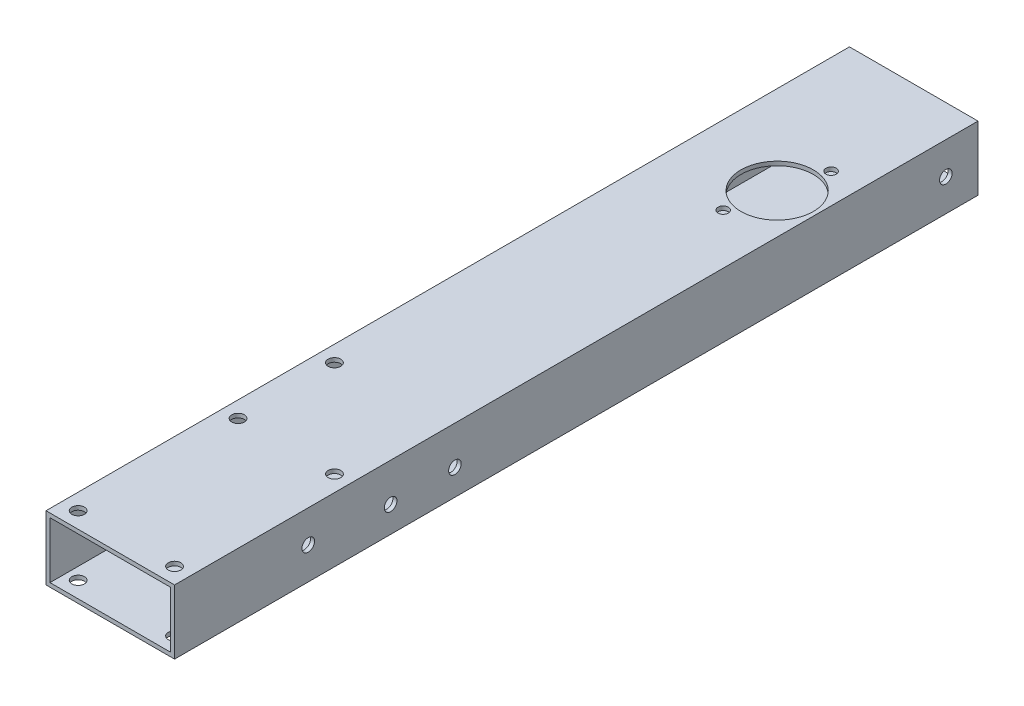
ISO-10303-21;
HEADER;
FILE_DESCRIPTION(('STEP AP214'),'2;1');
FILE_NAME('part.step','',(''),(''),'','','');
FILE_SCHEMA(('AUTOMOTIVE_DESIGN { 1 0 10303 214 1 1 1 1 }'));
ENDSEC;
DATA;
#1=APPLICATION_CONTEXT('core data for automotive mechanical design processes');
#2=APPLICATION_PROTOCOL_DEFINITION('international standard','automotive_design',2000,#1);
#3=PRODUCT_CONTEXT('',#1,'mechanical');
#4=PRODUCT('Part','Part','',(#3));
#5=PRODUCT_RELATED_PRODUCT_CATEGORY('part','',(#4));
#6=PRODUCT_DEFINITION_FORMATION('','',#4);
#7=PRODUCT_DEFINITION_CONTEXT('part definition',#1,'design');
#8=PRODUCT_DEFINITION('design','',#6,#7);
#9=PRODUCT_DEFINITION_SHAPE('','',#8);
#10=(LENGTH_UNIT() NAMED_UNIT(*) SI_UNIT(.MILLI.,.METRE.));
#11=(NAMED_UNIT(*) PLANE_ANGLE_UNIT() SI_UNIT($,.RADIAN.));
#12=(NAMED_UNIT(*) SI_UNIT($,.STERADIAN.) SOLID_ANGLE_UNIT());
#13=UNCERTAINTY_MEASURE_WITH_UNIT(LENGTH_MEASURE(1.E-05),#10,'distance_accuracy_value','');
#14=(GEOMETRIC_REPRESENTATION_CONTEXT(3) GLOBAL_UNCERTAINTY_ASSIGNED_CONTEXT((#13)) GLOBAL_UNIT_ASSIGNED_CONTEXT((#10,
#11,#12)) REPRESENTATION_CONTEXT('',''));
#15=CARTESIAN_POINT('',(0.,0.,0.));
#16=DIRECTION('',(0.,0.,1.));
#17=DIRECTION('',(1.,0.,0.));
#18=AXIS2_PLACEMENT_3D('',#15,#16,#17);
#19=CARTESIAN_POINT('',(25.4,-12.7,158.750000508));
#20=DIRECTION('',(-1.,0.,0.));
#21=DIRECTION('',(0.,0.,1.));
#22=AXIS2_PLACEMENT_3D('',#19,#20,#21);
#23=PLANE('',#22);
#24=CARTESIAN_POINT('',(25.4,7.7715611723761E-13,-146.050000508429));
#25=DIRECTION('',(1.,0.,0.));
#26=DIRECTION('',(0.,0.,-1.));
#27=AXIS2_PLACEMENT_3D('',#24,#25,#26);
#28=CIRCLE('',#27,2.48919999999999);
#29=CARTESIAN_POINT('',(25.4,7.7715611723761E-13,-148.539200508429));
#30=VERTEX_POINT('',#29);
#31=EDGE_CURVE('E469',#30,#30,#28,.T.);
#32=ORIENTED_EDGE('',*,*,#31,.F.);
#33=EDGE_LOOP('',(#32));
#34=FACE_BOUND('',#33,.T.);
#35=CARTESIAN_POINT('',(25.4,-2.42500000000023,73.35818864884));
#36=DIRECTION('',(-1.,0.,0.));
#37=DIRECTION('',(0.,0.,1.));
#38=AXIS2_PLACEMENT_3D('',#35,#36,#37);
#39=CIRCLE('',#38,2.48919999999998);
#40=CARTESIAN_POINT('',(25.4,-2.42500000000023,75.84738864884));
#41=VERTEX_POINT('',#40);
#42=EDGE_CURVE('E244',#41,#41,#39,.T.);
#43=ORIENTED_EDGE('',*,*,#42,.T.);
#44=EDGE_LOOP('',(#43));
#45=FACE_BOUND('',#44,.T.);
#46=CARTESIAN_POINT('',(25.4,-2.42500000000023,47.95818864884));
#47=DIRECTION('',(-1.,0.,0.));
#48=DIRECTION('',(0.,0.,1.));
#49=AXIS2_PLACEMENT_3D('',#46,#47,#48);
#50=CIRCLE('',#49,2.48919999999998);
#51=CARTESIAN_POINT('',(25.4,-2.42500000000023,50.44738864884));
#52=VERTEX_POINT('',#51);
#53=EDGE_CURVE('E238',#52,#52,#50,.T.);
#54=ORIENTED_EDGE('',*,*,#53,.T.);
#55=EDGE_LOOP('',(#54));
#56=FACE_BOUND('',#55,.T.);
#57=DIRECTION('',(0.,0.,-1.));
#58=VECTOR('',#57,1.);
#59=CARTESIAN_POINT('',(25.4,-12.7,158.750000508));
#60=LINE('',#59,#58);
#61=CARTESIAN_POINT('',(25.4,-12.7,158.750000508));
#62=VERTEX_POINT('',#61);
#63=CARTESIAN_POINT('',(25.4,-12.7,-158.750000508));
#64=VERTEX_POINT('',#63);
#65=EDGE_CURVE('E66',#62,#64,#60,.T.);
#66=ORIENTED_EDGE('',*,*,#65,.T.);
#67=DIRECTION('',(0.,1.,0.));
#68=VECTOR('',#67,1.);
#69=CARTESIAN_POINT('',(25.4,-12.7,-158.750000508));
#70=LINE('',#69,#68);
#71=CARTESIAN_POINT('',(25.4,12.7,-158.750000508));
#72=VERTEX_POINT('',#71);
#73=EDGE_CURVE('E180',#64,#72,#70,.T.);
#74=ORIENTED_EDGE('',*,*,#73,.T.);
#75=DIRECTION('',(0.,0.,-1.));
#76=VECTOR('',#75,1.);
#77=CARTESIAN_POINT('',(25.4,12.7,158.750000508));
#78=LINE('',#77,#76);
#79=CARTESIAN_POINT('',(25.4,12.7,158.750000508));
#80=VERTEX_POINT('',#79);
#81=EDGE_CURVE('E225',#80,#72,#78,.T.);
#82=ORIENTED_EDGE('',*,*,#81,.F.);
#83=DIRECTION('',(0.,1.,0.));
#84=VECTOR('',#83,1.);
#85=CARTESIAN_POINT('',(25.4,-12.7,158.750000508));
#86=LINE('',#85,#84);
#87=EDGE_CURVE('E216',#62,#80,#86,.T.);
#88=ORIENTED_EDGE('',*,*,#87,.F.);
#89=EDGE_LOOP('',(#66,#74,#82,#88));
#90=FACE_BOUND('',#89,.T.);
#91=CARTESIAN_POINT('',(25.4,7.49400541621981E-13,105.917999491571));
#92=DIRECTION('',(1.,0.,0.));
#93=DIRECTION('',(0.,0.,-1.));
#94=AXIS2_PLACEMENT_3D('',#91,#92,#93);
#95=CIRCLE('',#94,2.48919999999999);
#96=CARTESIAN_POINT('',(25.4,7.49400541621981E-13,103.428799491571));
#97=VERTEX_POINT('',#96);
#98=EDGE_CURVE('E479',#97,#97,#95,.T.);
#99=ORIENTED_EDGE('',*,*,#98,.F.);
#100=EDGE_LOOP('',(#99));
#101=FACE_BOUND('',#100,.T.);
#102=ADVANCED_FACE('F56',(#34,#45,#56,#90,#101),#23,.F.);
#103=CARTESIAN_POINT('',(0.,0.,158.750000508));
#104=DIRECTION('',(0.,0.,1.));
#105=DIRECTION('',(1.,0.,0.));
#106=AXIS2_PLACEMENT_3D('',#103,#104,#105);
#107=PLANE('',#106);
#108=DIRECTION('',(0.,-1.,0.));
#109=VECTOR('',#108,1.);
#110=CARTESIAN_POINT('',(-25.4,12.7,158.750000508));
#111=LINE('',#110,#109);
#112=CARTESIAN_POINT('',(-25.4,12.7,158.750000508));
#113=VERTEX_POINT('',#112);
#114=CARTESIAN_POINT('',(-25.4,-12.7,158.750000508));
#115=VERTEX_POINT('',#114);
#116=EDGE_CURVE('E139',#113,#115,#111,.T.);
#117=ORIENTED_EDGE('',*,*,#116,.T.);
#118=DIRECTION('',(1.,0.,0.));
#119=VECTOR('',#118,1.);
#120=CARTESIAN_POINT('',(-25.4,-12.7,158.750000508));
#121=LINE('',#120,#119);
#122=EDGE_CURVE('E213',#115,#62,#121,.T.);
#123=ORIENTED_EDGE('',*,*,#122,.T.);
#124=ORIENTED_EDGE('',*,*,#87,.T.);
#125=DIRECTION('',(-1.,0.,0.));
#126=VECTOR('',#125,1.);
#127=CARTESIAN_POINT('',(25.4,12.7,158.750000508));
#128=LINE('',#127,#126);
#129=EDGE_CURVE('E219',#80,#113,#128,.T.);
#130=ORIENTED_EDGE('',*,*,#129,.T.);
#131=EDGE_LOOP('',(#117,#123,#124,#130));
#132=FACE_BOUND('',#131,.T.);
#133=DIRECTION('',(1.,0.,0.));
#134=VECTOR('',#133,1.);
#135=CARTESIAN_POINT('',(-23.8125,-11.1125,158.750000508));
#136=LINE('',#135,#134);
#137=CARTESIAN_POINT('',(-23.8125,-11.1125,158.750000508));
#138=VERTEX_POINT('',#137);
#139=CARTESIAN_POINT('',(23.8125,-11.1125,158.750000508));
#140=VERTEX_POINT('',#139);
#141=EDGE_CURVE('E190',#138,#140,#136,.T.);
#142=ORIENTED_EDGE('',*,*,#141,.F.);
#143=DIRECTION('',(0.,-1.,0.));
#144=VECTOR('',#143,1.);
#145=CARTESIAN_POINT('',(-23.8125,11.1125,158.750000508));
#146=LINE('',#145,#144);
#147=CARTESIAN_POINT('',(-23.8125,11.1125,158.750000508));
#148=VERTEX_POINT('',#147);
#149=EDGE_CURVE('E135',#148,#138,#146,.T.);
#150=ORIENTED_EDGE('',*,*,#149,.F.);
#151=DIRECTION('',(-1.,0.,0.));
#152=VECTOR('',#151,1.);
#153=CARTESIAN_POINT('',(23.8125,11.1125,158.750000508));
#154=LINE('',#153,#152);
#155=CARTESIAN_POINT('',(23.8125,11.1125,158.750000508));
#156=VERTEX_POINT('',#155);
#157=EDGE_CURVE('E197',#156,#148,#154,.T.);
#158=ORIENTED_EDGE('',*,*,#157,.F.);
#159=DIRECTION('',(0.,1.,0.));
#160=VECTOR('',#159,1.);
#161=CARTESIAN_POINT('',(23.8125,-11.1125,158.750000508));
#162=LINE('',#161,#160);
#163=EDGE_CURVE('E193',#140,#156,#162,.T.);
#164=ORIENTED_EDGE('',*,*,#163,.F.);
#165=EDGE_LOOP('',(#142,#150,#158,#164));
#166=FACE_BOUND('',#165,.T.);
#167=ADVANCED_FACE('F490',(#132,#166),#107,.T.);
#168=CARTESIAN_POINT('',(-25.4,12.7,158.750000508));
#169=DIRECTION('',(1.,0.,0.));
#170=DIRECTION('',(0.,0.,-1.));
#171=AXIS2_PLACEMENT_3D('',#168,#169,#170);
#172=PLANE('',#171);
#173=CARTESIAN_POINT('',(-25.4,-2.42500000000023,73.35818864884));
#174=DIRECTION('',(-1.,0.,0.));
#175=DIRECTION('',(0.,0.,1.));
#176=AXIS2_PLACEMENT_3D('',#173,#174,#175);
#177=CIRCLE('',#176,2.48919999999999);
#178=CARTESIAN_POINT('',(-25.4,-2.42500000000023,75.84738864884));
#179=VERTEX_POINT('',#178);
#180=EDGE_CURVE('E366',#179,#179,#177,.T.);
#181=ORIENTED_EDGE('',*,*,#180,.F.);
#182=EDGE_LOOP('',(#181));
#183=FACE_BOUND('',#182,.T.);
#184=CARTESIAN_POINT('',(-25.4,-2.42500000000023,47.95818864884));
#185=DIRECTION('',(-1.,0.,0.));
#186=DIRECTION('',(0.,0.,1.));
#187=AXIS2_PLACEMENT_3D('',#184,#185,#186);
#188=CIRCLE('',#187,2.48919999999999);
#189=CARTESIAN_POINT('',(-25.4,-2.42500000000023,50.44738864884));
#190=VERTEX_POINT('',#189);
#191=EDGE_CURVE('E376',#190,#190,#188,.T.);
#192=ORIENTED_EDGE('',*,*,#191,.F.);
#193=EDGE_LOOP('',(#192));
#194=FACE_BOUND('',#193,.T.);
#195=DIRECTION('',(0.,0.,-1.));
#196=VECTOR('',#195,1.);
#197=CARTESIAN_POINT('',(-25.4,12.7,158.750000508));
#198=LINE('',#197,#196);
#199=CARTESIAN_POINT('',(-25.4,12.7,-158.750000508));
#200=VERTEX_POINT('',#199);
#201=EDGE_CURVE('E222',#113,#200,#198,.T.);
#202=ORIENTED_EDGE('',*,*,#201,.T.);
#203=DIRECTION('',(0.,-1.,0.));
#204=VECTOR('',#203,1.);
#205=CARTESIAN_POINT('',(-25.4,12.7,-158.750000508));
#206=LINE('',#205,#204);
#207=CARTESIAN_POINT('',(-25.4,-12.7,-158.750000508));
#208=VERTEX_POINT('',#207);
#209=EDGE_CURVE('E172',#200,#208,#206,.T.);
#210=ORIENTED_EDGE('',*,*,#209,.T.);
#211=DIRECTION('',(0.,0.,-1.));
#212=VECTOR('',#211,1.);
#213=CARTESIAN_POINT('',(-25.4,-12.7,158.750000508));
#214=LINE('',#213,#212);
#215=EDGE_CURVE('E13',#115,#208,#214,.T.);
#216=ORIENTED_EDGE('',*,*,#215,.F.);
#217=ORIENTED_EDGE('',*,*,#116,.F.);
#218=EDGE_LOOP('',(#202,#210,#216,#217));
#219=FACE_BOUND('',#218,.T.);
#220=ADVANCED_FACE('F58',(#183,#194,#219),#172,.F.);
#221=CARTESIAN_POINT('',(-25.4,-12.7,158.750000508));
#222=DIRECTION('',(0.,1.,0.));
#223=DIRECTION('',(-1.,0.,0.));
#224=AXIS2_PLACEMENT_3D('',#221,#222,#223);
#225=PLANE('',#224);
#226=CARTESIAN_POINT('',(13.5246297417502,-12.7,-112.574300260917));
#227=DIRECTION('',(0.,1.,0.));
#228=DIRECTION('',(0.,0.,1.));
#229=AXIS2_PLACEMENT_3D('',#226,#227,#228);
#230=CIRCLE('',#229,2.0447);
#231=CARTESIAN_POINT('',(13.5246297417502,-12.7,-110.529600260917));
#232=VERTEX_POINT('',#231);
#233=EDGE_CURVE('E278',#232,#232,#230,.T.);
#234=ORIENTED_EDGE('',*,*,#233,.T.);
#235=EDGE_LOOP('',(#234));
#236=FACE_BOUND('',#235,.T.);
#237=CARTESIAN_POINT('',(5.52537025825205,-12.7,-77.9257007550834));
#238=DIRECTION('',(0.,1.,0.));
#239=DIRECTION('',(0.,0.,1.));
#240=AXIS2_PLACEMENT_3D('',#237,#238,#239);
#241=CIRCLE('',#240,2.0447);
#242=CARTESIAN_POINT('',(5.52537025825205,-12.7,-75.8810007550834));
#243=VERTEX_POINT('',#242);
#244=EDGE_CURVE('E273',#243,#243,#241,.T.);
#245=ORIENTED_EDGE('',*,*,#244,.T.);
#246=EDGE_LOOP('',(#245));
#247=FACE_BOUND('',#246,.T.);
#248=CARTESIAN_POINT('',(-19.0500000000028,-12.7,51.11308049299));
#249=DIRECTION('',(0.,-1.,0.));
#250=DIRECTION('',(0.,0.,-1.));
#251=AXIS2_PLACEMENT_3D('',#248,#249,#250);
#252=CIRCLE('',#251,2.48919999999999);
#253=CARTESIAN_POINT('',(-19.0500000000028,-12.7,48.62388049299));
#254=VERTEX_POINT('',#253);
#255=EDGE_CURVE('E310',#254,#254,#252,.T.);
#256=ORIENTED_EDGE('',*,*,#255,.F.);
#257=EDGE_LOOP('',(#256));
#258=FACE_BOUND('',#257,.T.);
#259=CARTESIAN_POINT('',(-19.050000000002,-12.7,89.2130804929901));
#260=DIRECTION('',(0.,-1.,0.));
#261=DIRECTION('',(0.,0.,-1.));
#262=AXIS2_PLACEMENT_3D('',#259,#260,#261);
#263=CIRCLE('',#262,2.48919999999999);
#264=CARTESIAN_POINT('',(-19.050000000002,-12.7,86.7238804929901));
#265=VERTEX_POINT('',#264);
#266=EDGE_CURVE('E320',#265,#265,#263,.T.);
#267=ORIENTED_EDGE('',*,*,#266,.F.);
#268=EDGE_LOOP('',(#267));
#269=FACE_BOUND('',#268,.T.);
#270=CARTESIAN_POINT('',(19.0499999999981,-12.7,89.2130804929891));
#271=DIRECTION('',(0.,-1.,0.));
#272=DIRECTION('',(0.,0.,-1.));
#273=AXIS2_PLACEMENT_3D('',#270,#271,#272);
#274=CIRCLE('',#273,2.48919999999999);
#275=CARTESIAN_POINT('',(19.0499999999981,-12.7,86.7238804929891));
#276=VERTEX_POINT('',#275);
#277=EDGE_CURVE('E330',#276,#276,#274,.T.);
#278=ORIENTED_EDGE('',*,*,#277,.F.);
#279=EDGE_LOOP('',(#278));
#280=FACE_BOUND('',#279,.T.);
#281=CARTESIAN_POINT('',(19.0499999999997,-12.7,152.400000507999));
#282=DIRECTION('',(0.,-1.,0.));
#283=DIRECTION('',(0.,0.,-1.));
#284=AXIS2_PLACEMENT_3D('',#281,#282,#283);
#285=CIRCLE('',#284,2.48919999999999);
#286=CARTESIAN_POINT('',(19.0499999999997,-12.7,149.910800507999));
#287=VERTEX_POINT('',#286);
#288=EDGE_CURVE('E340',#287,#287,#285,.T.);
#289=ORIENTED_EDGE('',*,*,#288,.F.);
#290=EDGE_LOOP('',(#289));
#291=FACE_BOUND('',#290,.T.);
#292=CARTESIAN_POINT('',(-19.0500000000003,-12.7,152.400000508));
#293=DIRECTION('',(0.,-1.,0.));
#294=DIRECTION('',(0.,0.,-1.));
#295=AXIS2_PLACEMENT_3D('',#292,#293,#294);
#296=CIRCLE('',#295,2.48919999999999);
#297=CARTESIAN_POINT('',(-19.0500000000003,-12.7,149.910800508));
#298=VERTEX_POINT('',#297);
#299=EDGE_CURVE('E356',#298,#298,#296,.T.);
#300=ORIENTED_EDGE('',*,*,#299,.F.);
#301=EDGE_LOOP('',(#300));
#302=FACE_BOUND('',#301,.T.);
#303=CARTESIAN_POINT('',(9.52500000000001,-12.7,-95.250000508));
#304=DIRECTION('',(0.,1.,0.));
#305=DIRECTION('',(-1.,0.,0.));
#306=AXIS2_PLACEMENT_3D('',#303,#304,#305);
#307=CIRCLE('',#306,14.2875);
#308=CARTESIAN_POINT('',(-4.7625,-12.7,-95.250000508));
#309=VERTEX_POINT('',#308);
#310=EDGE_CURVE('E159',#309,#309,#307,.T.);
#311=ORIENTED_EDGE('',*,*,#310,.T.);
#312=EDGE_LOOP('',(#311));
#313=FACE_BOUND('',#312,.T.);
#314=ORIENTED_EDGE('',*,*,#215,.T.);
#315=DIRECTION('',(1.,0.,0.));
#316=VECTOR('',#315,1.);
#317=CARTESIAN_POINT('',(-25.4,-12.7,-158.750000508));
#318=LINE('',#317,#316);
#319=EDGE_CURVE('E176',#208,#64,#318,.T.);
#320=ORIENTED_EDGE('',*,*,#319,.T.);
#321=ORIENTED_EDGE('',*,*,#65,.F.);
#322=ORIENTED_EDGE('',*,*,#122,.F.);
#323=EDGE_LOOP('',(#314,#320,#321,#322));
#324=FACE_BOUND('',#323,.T.);
#325=ADVANCED_FACE('F504',(#236,#247,#258,#269,#280,#291,#302,#313,#324),#225,.F.);
#326=CARTESIAN_POINT('',(25.4,12.7,158.750000508));
#327=DIRECTION('',(0.,-1.,0.));
#328=DIRECTION('',(1.,0.,0.));
#329=AXIS2_PLACEMENT_3D('',#326,#327,#328);
#330=PLANE('',#329);
#331=CARTESIAN_POINT('',(13.5246297417502,12.7,-112.574300260917));
#332=DIRECTION('',(0.,1.,0.));
#333=DIRECTION('',(0.,0.,1.));
#334=AXIS2_PLACEMENT_3D('',#331,#332,#333);
#335=CIRCLE('',#334,2.0447);
#336=CARTESIAN_POINT('',(13.5246297417502,12.7,-110.529600260917));
#337=VERTEX_POINT('',#336);
#338=EDGE_CURVE('E289',#337,#337,#335,.T.);
#339=ORIENTED_EDGE('',*,*,#338,.F.);
#340=EDGE_LOOP('',(#339));
#341=FACE_BOUND('',#340,.T.);
#342=CARTESIAN_POINT('',(5.52537025825205,12.7,-77.9257007550834));
#343=DIRECTION('',(0.,1.,0.));
#344=DIRECTION('',(0.,0.,1.));
#345=AXIS2_PLACEMENT_3D('',#342,#343,#344);
#346=CIRCLE('',#345,2.0447);
#347=CARTESIAN_POINT('',(5.52537025825205,12.7,-75.8810007550834));
#348=VERTEX_POINT('',#347);
#349=EDGE_CURVE('E286',#348,#348,#346,.T.);
#350=ORIENTED_EDGE('',*,*,#349,.F.);
#351=EDGE_LOOP('',(#350));
#352=FACE_BOUND('',#351,.T.);
#353=CARTESIAN_POINT('',(-19.0500000000028,12.7,51.11308049299));
#354=DIRECTION('',(0.,-1.,0.));
#355=DIRECTION('',(0.,0.,-1.));
#356=AXIS2_PLACEMENT_3D('',#353,#354,#355);
#357=CIRCLE('',#356,2.48919999999999);
#358=CARTESIAN_POINT('',(-19.0500000000028,12.7,48.62388049299));
#359=VERTEX_POINT('',#358);
#360=EDGE_CURVE('E268',#359,#359,#357,.T.);
#361=ORIENTED_EDGE('',*,*,#360,.T.);
#362=EDGE_LOOP('',(#361));
#363=FACE_BOUND('',#362,.T.);
#364=CARTESIAN_POINT('',(-19.050000000002,12.7,89.2130804929901));
#365=DIRECTION('',(0.,-1.,0.));
#366=DIRECTION('',(0.,0.,-1.));
#367=AXIS2_PLACEMENT_3D('',#364,#365,#366);
#368=CIRCLE('',#367,2.48919999999999);
#369=CARTESIAN_POINT('',(-19.050000000002,12.7,86.7238804929901));
#370=VERTEX_POINT('',#369);
#371=EDGE_CURVE('E262',#370,#370,#368,.T.);
#372=ORIENTED_EDGE('',*,*,#371,.T.);
#373=EDGE_LOOP('',(#372));
#374=FACE_BOUND('',#373,.T.);
#375=CARTESIAN_POINT('',(19.0499999999981,12.7,89.2130804929891));
#376=DIRECTION('',(0.,-1.,0.));
#377=DIRECTION('',(0.,0.,-1.));
#378=AXIS2_PLACEMENT_3D('',#375,#376,#377);
#379=CIRCLE('',#378,2.48919999999999);
#380=CARTESIAN_POINT('',(19.0499999999981,12.7,86.7238804929891));
#381=VERTEX_POINT('',#380);
#382=EDGE_CURVE('E256',#381,#381,#379,.T.);
#383=ORIENTED_EDGE('',*,*,#382,.T.);
#384=EDGE_LOOP('',(#383));
#385=FACE_BOUND('',#384,.T.);
#386=CARTESIAN_POINT('',(19.0499999999997,12.7,152.400000507999));
#387=DIRECTION('',(0.,-1.,0.));
#388=DIRECTION('',(0.,0.,-1.));
#389=AXIS2_PLACEMENT_3D('',#386,#387,#388);
#390=CIRCLE('',#389,2.48919999999999);
#391=CARTESIAN_POINT('',(19.0499999999997,12.7,149.910800507999));
#392=VERTEX_POINT('',#391);
#393=EDGE_CURVE('E344',#392,#392,#390,.T.);
#394=ORIENTED_EDGE('',*,*,#393,.T.);
#395=EDGE_LOOP('',(#394));
#396=FACE_BOUND('',#395,.T.);
#397=CARTESIAN_POINT('',(-19.0500000000003,12.7,152.400000508));
#398=DIRECTION('',(0.,-1.,0.));
#399=DIRECTION('',(0.,0.,-1.));
#400=AXIS2_PLACEMENT_3D('',#397,#398,#399);
#401=CIRCLE('',#400,2.48919999999999);
#402=CARTESIAN_POINT('',(-19.0500000000003,12.7,149.910800508));
#403=VERTEX_POINT('',#402);
#404=EDGE_CURVE('E250',#403,#403,#401,.T.);
#405=ORIENTED_EDGE('',*,*,#404,.T.);
#406=EDGE_LOOP('',(#405));
#407=FACE_BOUND('',#406,.T.);
#408=CARTESIAN_POINT('',(9.52500000000001,12.7,-95.250000508));
#409=DIRECTION('',(0.,1.,0.));
#410=DIRECTION('',(-1.,0.,0.));
#411=AXIS2_PLACEMENT_3D('',#408,#409,#410);
#412=CIRCLE('',#411,14.2875);
#413=CARTESIAN_POINT('',(-4.7625,12.7,-95.250000508));
#414=VERTEX_POINT('',#413);
#415=EDGE_CURVE('E232',#414,#414,#412,.T.);
#416=ORIENTED_EDGE('',*,*,#415,.F.);
#417=EDGE_LOOP('',(#416));
#418=FACE_BOUND('',#417,.T.);
#419=ORIENTED_EDGE('',*,*,#81,.T.);
#420=DIRECTION('',(-1.,0.,0.));
#421=VECTOR('',#420,1.);
#422=CARTESIAN_POINT('',(25.4,12.7,-158.750000508));
#423=LINE('',#422,#421);
#424=EDGE_CURVE('E184',#72,#200,#423,.T.);
#425=ORIENTED_EDGE('',*,*,#424,.T.);
#426=ORIENTED_EDGE('',*,*,#201,.F.);
#427=ORIENTED_EDGE('',*,*,#129,.F.);
#428=EDGE_LOOP('',(#419,#425,#426,#427));
#429=FACE_BOUND('',#428,.T.);
#430=ADVANCED_FACE('F503',(#341,#352,#363,#374,#385,#396,#407,#418,#429),#330,.F.);
#431=CARTESIAN_POINT('',(-23.8125,11.1125,158.750000508));
#432=DIRECTION('',(1.,0.,0.));
#433=DIRECTION('',(0.,1.,0.));
#434=AXIS2_PLACEMENT_3D('',#431,#432,#433);
#435=PLANE('',#434);
#436=CARTESIAN_POINT('',(-23.8125,-2.42500000000023,73.35818864884));
#437=DIRECTION('',(1.,0.,0.));
#438=DIRECTION('',(0.,1.,0.));
#439=AXIS2_PLACEMENT_3D('',#436,#437,#438);
#440=CIRCLE('',#439,2.48919999999999);
#441=CARTESIAN_POINT('',(-23.8125,0.0641999999997584,73.35818864884));
#442=VERTEX_POINT('',#441);
#443=EDGE_CURVE('E243',#442,#442,#440,.T.);
#444=ORIENTED_EDGE('',*,*,#443,.F.);
#445=EDGE_LOOP('',(#444));
#446=FACE_BOUND('',#445,.T.);
#447=CARTESIAN_POINT('',(-23.8125,-2.42500000000023,47.95818864884));
#448=DIRECTION('',(1.,0.,0.));
#449=DIRECTION('',(0.,1.,0.));
#450=AXIS2_PLACEMENT_3D('',#447,#448,#449);
#451=CIRCLE('',#450,2.48919999999999);
#452=CARTESIAN_POINT('',(-23.8125,0.0641999999997584,47.95818864884));
#453=VERTEX_POINT('',#452);
#454=EDGE_CURVE('E233',#453,#453,#451,.T.);
#455=ORIENTED_EDGE('',*,*,#454,.F.);
#456=EDGE_LOOP('',(#455));
#457=FACE_BOUND('',#456,.T.);
#458=DIRECTION('',(0.,0.,-1.));
#459=VECTOR('',#458,1.);
#460=CARTESIAN_POINT('',(-23.8125,-11.1125,158.750000508));
#461=LINE('',#460,#459);
#462=CARTESIAN_POINT('',(-23.8125,-11.1125,-158.750000508));
#463=VERTEX_POINT('',#462);
#464=EDGE_CURVE('E127',#138,#463,#461,.T.);
#465=ORIENTED_EDGE('',*,*,#464,.T.);
#466=DIRECTION('',(0.,-1.,0.));
#467=VECTOR('',#466,1.);
#468=CARTESIAN_POINT('',(-23.8125,11.1125,-158.750000508));
#469=LINE('',#468,#467);
#470=CARTESIAN_POINT('',(-23.8125,11.1125,-158.750000508));
#471=VERTEX_POINT('',#470);
#472=EDGE_CURVE('E132',#471,#463,#469,.T.);
#473=ORIENTED_EDGE('',*,*,#472,.F.);
#474=DIRECTION('',(0.,0.,-1.));
#475=VECTOR('',#474,1.);
#476=CARTESIAN_POINT('',(-23.8125,11.1125,158.750000508));
#477=LINE('',#476,#475);
#478=EDGE_CURVE('E200',#148,#471,#477,.T.);
#479=ORIENTED_EDGE('',*,*,#478,.F.);
#480=ORIENTED_EDGE('',*,*,#149,.T.);
#481=EDGE_LOOP('',(#465,#473,#479,#480));
#482=FACE_BOUND('',#481,.T.);
#483=ADVANCED_FACE('F129',(#446,#457,#482),#435,.T.);
#484=CARTESIAN_POINT('',(-23.8125,-11.1125,158.750000508));
#485=DIRECTION('',(0.,1.,0.));
#486=DIRECTION('',(0.,0.,1.));
#487=AXIS2_PLACEMENT_3D('',#484,#485,#486);
#488=PLANE('',#487);
#489=CARTESIAN_POINT('',(13.5246297417502,-11.1125,-112.574300260917));
#490=DIRECTION('',(0.,1.,0.));
#491=DIRECTION('',(0.,0.,1.));
#492=AXIS2_PLACEMENT_3D('',#489,#490,#491);
#493=CIRCLE('',#492,2.0447);
#494=CARTESIAN_POINT('',(13.5246297417502,-11.1125,-110.529600260917));
#495=VERTEX_POINT('',#494);
#496=EDGE_CURVE('E274',#495,#495,#493,.T.);
#497=ORIENTED_EDGE('',*,*,#496,.F.);
#498=EDGE_LOOP('',(#497));
#499=FACE_BOUND('',#498,.T.);
#500=CARTESIAN_POINT('',(5.52537025825205,-11.1125,-77.9257007550834));
#501=DIRECTION('',(0.,1.,0.));
#502=DIRECTION('',(0.,0.,1.));
#503=AXIS2_PLACEMENT_3D('',#500,#501,#502);
#504=CIRCLE('',#503,2.0447);
#505=CARTESIAN_POINT('',(5.52537025825205,-11.1125,-75.8810007550834));
#506=VERTEX_POINT('',#505);
#507=EDGE_CURVE('E269',#506,#506,#504,.T.);
#508=ORIENTED_EDGE('',*,*,#507,.F.);
#509=EDGE_LOOP('',(#508));
#510=FACE_BOUND('',#509,.T.);
#511=CARTESIAN_POINT('',(-19.0500000000028,-11.1125,51.11308049299));
#512=DIRECTION('',(0.,1.,0.));
#513=DIRECTION('',(0.,0.,1.));
#514=AXIS2_PLACEMENT_3D('',#511,#512,#513);
#515=CIRCLE('',#514,2.48919999999999);
#516=CARTESIAN_POINT('',(-19.0500000000028,-11.1125,53.60228049299));
#517=VERTEX_POINT('',#516);
#518=EDGE_CURVE('E263',#517,#517,#515,.T.);
#519=ORIENTED_EDGE('',*,*,#518,.F.);
#520=EDGE_LOOP('',(#519));
#521=FACE_BOUND('',#520,.T.);
#522=CARTESIAN_POINT('',(-19.050000000002,-11.1125,89.2130804929901));
#523=DIRECTION('',(0.,1.,0.));
#524=DIRECTION('',(0.,0.,1.));
#525=AXIS2_PLACEMENT_3D('',#522,#523,#524);
#526=CIRCLE('',#525,2.48919999999999);
#527=CARTESIAN_POINT('',(-19.050000000002,-11.1125,91.7022804929901));
#528=VERTEX_POINT('',#527);
#529=EDGE_CURVE('E261',#528,#528,#526,.T.);
#530=ORIENTED_EDGE('',*,*,#529,.F.);
#531=EDGE_LOOP('',(#530));
#532=FACE_BOUND('',#531,.T.);
#533=CARTESIAN_POINT('',(19.0499999999981,-11.1125,89.2130804929891));
#534=DIRECTION('',(0.,1.,0.));
#535=DIRECTION('',(0.,0.,1.));
#536=AXIS2_PLACEMENT_3D('',#533,#534,#535);
#537=CIRCLE('',#536,2.48919999999999);
#538=CARTESIAN_POINT('',(19.0499999999981,-11.1125,91.7022804929891));
#539=VERTEX_POINT('',#538);
#540=EDGE_CURVE('E255',#539,#539,#537,.T.);
#541=ORIENTED_EDGE('',*,*,#540,.F.);
#542=EDGE_LOOP('',(#541));
#543=FACE_BOUND('',#542,.T.);
#544=CARTESIAN_POINT('',(19.0499999999997,-11.1125,152.400000507999));
#545=DIRECTION('',(0.,1.,0.));
#546=DIRECTION('',(0.,0.,1.));
#547=AXIS2_PLACEMENT_3D('',#544,#545,#546);
#548=CIRCLE('',#547,2.48919999999999);
#549=CARTESIAN_POINT('',(19.0499999999997,-11.1125,154.889200507999));
#550=VERTEX_POINT('',#549);
#551=EDGE_CURVE('E348',#550,#550,#548,.T.);
#552=ORIENTED_EDGE('',*,*,#551,.F.);
#553=EDGE_LOOP('',(#552));
#554=FACE_BOUND('',#553,.T.);
#555=CARTESIAN_POINT('',(-19.0500000000003,-11.1125,152.400000508));
#556=DIRECTION('',(0.,1.,0.));
#557=DIRECTION('',(0.,0.,1.));
#558=AXIS2_PLACEMENT_3D('',#555,#556,#557);
#559=CIRCLE('',#558,2.48919999999999);
#560=CARTESIAN_POINT('',(-19.0500000000003,-11.1125,154.889200508));
#561=VERTEX_POINT('',#560);
#562=EDGE_CURVE('E249',#561,#561,#559,.T.);
#563=ORIENTED_EDGE('',*,*,#562,.F.);
#564=EDGE_LOOP('',(#563));
#565=FACE_BOUND('',#564,.T.);
#566=DIRECTION('',(0.,0.,-1.));
#567=VECTOR('',#566,1.);
#568=CARTESIAN_POINT('',(23.8125,-11.1125,158.750000508));
#569=LINE('',#568,#567);
#570=CARTESIAN_POINT('',(23.8125,-11.1125,-95.250000508));
#571=VERTEX_POINT('',#570);
#572=EDGE_CURVE('E140',#140,#571,#569,.T.);
#573=ORIENTED_EDGE('',*,*,#572,.T.);
#574=CARTESIAN_POINT('',(9.52500000000001,-11.1125,-95.250000508));
#575=DIRECTION('',(0.,1.,0.));
#576=DIRECTION('',(0.,0.,1.));
#577=AXIS2_PLACEMENT_3D('',#574,#575,#576);
#578=CIRCLE('',#577,14.2875);
#579=EDGE_CURVE('E72',#571,#571,#578,.T.);
#580=ORIENTED_EDGE('',*,*,#579,.F.);
#581=CARTESIAN_POINT('',(23.8125,-11.1125,-158.750000508));
#582=VERTEX_POINT('',#581);
#583=EDGE_CURVE('E147',#571,#582,#569,.T.);
#584=ORIENTED_EDGE('',*,*,#583,.T.);
#585=DIRECTION('',(1.,0.,0.));
#586=VECTOR('',#585,1.);
#587=CARTESIAN_POINT('',(-23.8125,-11.1125,-158.750000508));
#588=LINE('',#587,#586);
#589=EDGE_CURVE('E143',#463,#582,#588,.T.);
#590=ORIENTED_EDGE('',*,*,#589,.F.);
#591=ORIENTED_EDGE('',*,*,#464,.F.);
#592=ORIENTED_EDGE('',*,*,#141,.T.);
#593=EDGE_LOOP('',(#573,#580,#584,#590,#591,#592));
#594=FACE_BOUND('',#593,.T.);
#595=ADVANCED_FACE('F145',(#499,#510,#521,#532,#543,#554,#565,#594),#488,.T.);
#596=CARTESIAN_POINT('',(23.8125,-11.1125,158.750000508));
#597=DIRECTION('',(-1.,0.,0.));
#598=DIRECTION('',(0.,0.,1.));
#599=AXIS2_PLACEMENT_3D('',#596,#597,#598);
#600=PLANE('',#599);
#601=CARTESIAN_POINT('',(23.8125,7.49400541621981E-13,105.917999491571));
#602=DIRECTION('',(-1.,0.,0.));
#603=DIRECTION('',(0.,0.,1.));
#604=AXIS2_PLACEMENT_3D('',#601,#602,#603);
#605=CIRCLE('',#604,2.48919999999999);
#606=CARTESIAN_POINT('',(23.8125,7.49400541621981E-13,108.407199491571));
#607=VERTEX_POINT('',#606);
#608=EDGE_CURVE('E60',#607,#607,#605,.T.);
#609=ORIENTED_EDGE('',*,*,#608,.F.);
#610=EDGE_LOOP('',(#609));
#611=FACE_BOUND('',#610,.T.);
#612=CARTESIAN_POINT('',(23.8125,7.7715611723761E-13,-146.050000508429));
#613=DIRECTION('',(-1.,0.,0.));
#614=DIRECTION('',(0.,0.,1.));
#615=AXIS2_PLACEMENT_3D('',#612,#613,#614);
#616=CIRCLE('',#615,2.48919999999999);
#617=CARTESIAN_POINT('',(23.8125,7.7715611723761E-13,-143.560800508429));
#618=VERTEX_POINT('',#617);
#619=EDGE_CURVE('E297',#618,#618,#616,.T.);
#620=ORIENTED_EDGE('',*,*,#619,.F.);
#621=EDGE_LOOP('',(#620));
#622=FACE_BOUND('',#621,.T.);
#623=CARTESIAN_POINT('',(23.8125,-2.42500000000023,73.35818864884));
#624=DIRECTION('',(-1.,0.,0.));
#625=DIRECTION('',(0.,0.,1.));
#626=AXIS2_PLACEMENT_3D('',#623,#624,#625);
#627=CIRCLE('',#626,2.48919999999999);
#628=CARTESIAN_POINT('',(23.8125,-2.42500000000023,75.84738864884));
#629=VERTEX_POINT('',#628);
#630=EDGE_CURVE('E239',#629,#629,#627,.T.);
#631=ORIENTED_EDGE('',*,*,#630,.F.);
#632=EDGE_LOOP('',(#631));
#633=FACE_BOUND('',#632,.T.);
#634=CARTESIAN_POINT('',(23.8125,-2.42500000000023,47.95818864884));
#635=DIRECTION('',(-1.,0.,0.));
#636=DIRECTION('',(0.,0.,1.));
#637=AXIS2_PLACEMENT_3D('',#634,#635,#636);
#638=CIRCLE('',#637,2.48919999999999);
#639=CARTESIAN_POINT('',(23.8125,-2.42500000000023,50.44738864884));
#640=VERTEX_POINT('',#639);
#641=EDGE_CURVE('E237',#640,#640,#638,.T.);
#642=ORIENTED_EDGE('',*,*,#641,.F.);
#643=EDGE_LOOP('',(#642));
#644=FACE_BOUND('',#643,.T.);
#645=DIRECTION('',(0.,0.,-1.));
#646=VECTOR('',#645,1.);
#647=CARTESIAN_POINT('',(23.8125,11.1125,158.750000508));
#648=LINE('',#647,#646);
#649=CARTESIAN_POINT('',(23.8125,11.1125,-95.250000508));
#650=VERTEX_POINT('',#649);
#651=EDGE_CURVE('E204',#156,#650,#648,.T.);
#652=ORIENTED_EDGE('',*,*,#651,.T.);
#653=CARTESIAN_POINT('',(23.8125,11.1125,-158.750000508));
#654=VERTEX_POINT('',#653);
#655=EDGE_CURVE('E203',#650,#654,#648,.T.);
#656=ORIENTED_EDGE('',*,*,#655,.T.);
#657=DIRECTION('',(0.,1.,0.));
#658=VECTOR('',#657,1.);
#659=CARTESIAN_POINT('',(23.8125,-11.1125,-158.750000508));
#660=LINE('',#659,#658);
#661=EDGE_CURVE('E152',#582,#654,#660,.T.);
#662=ORIENTED_EDGE('',*,*,#661,.F.);
#663=ORIENTED_EDGE('',*,*,#583,.F.);
#664=ORIENTED_EDGE('',*,*,#572,.F.);
#665=ORIENTED_EDGE('',*,*,#163,.T.);
#666=EDGE_LOOP('',(#652,#656,#662,#663,#664,#665));
#667=FACE_BOUND('',#666,.T.);
#668=ADVANCED_FACE('F547',(#611,#622,#633,#644,#667),#600,.T.);
#669=CARTESIAN_POINT('',(23.8125,11.1125,158.750000508));
#670=DIRECTION('',(0.,-1.,0.));
#671=DIRECTION('',(0.,0.,-1.));
#672=AXIS2_PLACEMENT_3D('',#669,#670,#671);
#673=PLANE('',#672);
#674=CARTESIAN_POINT('',(13.5246297417502,11.1125,-112.574300260917));
#675=DIRECTION('',(0.,-1.,0.));
#676=DIRECTION('',(0.,0.,-1.));
#677=AXIS2_PLACEMENT_3D('',#674,#675,#676);
#678=CIRCLE('',#677,2.0447);
#679=CARTESIAN_POINT('',(13.5246297417502,11.1125,-114.619000260917));
#680=VERTEX_POINT('',#679);
#681=EDGE_CURVE('E277',#680,#680,#678,.T.);
#682=ORIENTED_EDGE('',*,*,#681,.F.);
#683=EDGE_LOOP('',(#682));
#684=FACE_BOUND('',#683,.T.);
#685=CARTESIAN_POINT('',(5.52537025825205,11.1125,-77.9257007550834));
#686=DIRECTION('',(0.,-1.,0.));
#687=DIRECTION('',(0.,0.,-1.));
#688=AXIS2_PLACEMENT_3D('',#685,#686,#687);
#689=CIRCLE('',#688,2.0447);
#690=CARTESIAN_POINT('',(5.52537025825205,11.1125,-79.9704007550834));
#691=VERTEX_POINT('',#690);
#692=EDGE_CURVE('E272',#691,#691,#689,.T.);
#693=ORIENTED_EDGE('',*,*,#692,.F.);
#694=EDGE_LOOP('',(#693));
#695=FACE_BOUND('',#694,.T.);
#696=CARTESIAN_POINT('',(-19.0500000000028,11.1125,51.11308049299));
#697=DIRECTION('',(0.,-1.,0.));
#698=DIRECTION('',(0.,0.,-1.));
#699=AXIS2_PLACEMENT_3D('',#696,#697,#698);
#700=CIRCLE('',#699,2.48919999999999);
#701=CARTESIAN_POINT('',(-19.0500000000028,11.1125,48.62388049299));
#702=VERTEX_POINT('',#701);
#703=EDGE_CURVE('E267',#702,#702,#700,.T.);
#704=ORIENTED_EDGE('',*,*,#703,.F.);
#705=EDGE_LOOP('',(#704));
#706=FACE_BOUND('',#705,.T.);
#707=CARTESIAN_POINT('',(-19.050000000002,11.1125,89.2130804929901));
#708=DIRECTION('',(0.,-1.,0.));
#709=DIRECTION('',(0.,0.,-1.));
#710=AXIS2_PLACEMENT_3D('',#707,#708,#709);
#711=CIRCLE('',#710,2.48919999999999);
#712=CARTESIAN_POINT('',(-19.050000000002,11.1125,86.7238804929901));
#713=VERTEX_POINT('',#712);
#714=EDGE_CURVE('E257',#713,#713,#711,.T.);
#715=ORIENTED_EDGE('',*,*,#714,.F.);
#716=EDGE_LOOP('',(#715));
#717=FACE_BOUND('',#716,.T.);
#718=CARTESIAN_POINT('',(19.0499999999981,11.1125,89.2130804929891));
#719=DIRECTION('',(0.,-1.,0.));
#720=DIRECTION('',(0.,0.,-1.));
#721=AXIS2_PLACEMENT_3D('',#718,#719,#720);
#722=CIRCLE('',#721,2.48919999999999);
#723=CARTESIAN_POINT('',(19.0499999999981,11.1125,86.7238804929891));
#724=VERTEX_POINT('',#723);
#725=EDGE_CURVE('E251',#724,#724,#722,.T.);
#726=ORIENTED_EDGE('',*,*,#725,.F.);
#727=EDGE_LOOP('',(#726));
#728=FACE_BOUND('',#727,.T.);
#729=CARTESIAN_POINT('',(19.0499999999997,11.1125,152.400000507999));
#730=DIRECTION('',(0.,-1.,0.));
#731=DIRECTION('',(0.,0.,-1.));
#732=AXIS2_PLACEMENT_3D('',#729,#730,#731);
#733=CIRCLE('',#732,2.48919999999999);
#734=CARTESIAN_POINT('',(19.0499999999997,11.1125,149.910800507999));
#735=VERTEX_POINT('',#734);
#736=EDGE_CURVE('E352',#735,#735,#733,.T.);
#737=ORIENTED_EDGE('',*,*,#736,.F.);
#738=EDGE_LOOP('',(#737));
#739=FACE_BOUND('',#738,.T.);
#740=CARTESIAN_POINT('',(-19.0500000000003,11.1125,152.400000508));
#741=DIRECTION('',(0.,-1.,0.));
#742=DIRECTION('',(0.,0.,-1.));
#743=AXIS2_PLACEMENT_3D('',#740,#741,#742);
#744=CIRCLE('',#743,2.48919999999999);
#745=CARTESIAN_POINT('',(-19.0500000000003,11.1125,149.910800508));
#746=VERTEX_POINT('',#745);
#747=EDGE_CURVE('E245',#746,#746,#744,.T.);
#748=ORIENTED_EDGE('',*,*,#747,.F.);
#749=EDGE_LOOP('',(#748));
#750=FACE_BOUND('',#749,.T.);
#751=ORIENTED_EDGE('',*,*,#655,.F.);
#752=CARTESIAN_POINT('',(9.52500000000001,11.1125,-95.250000508));
#753=DIRECTION('',(0.,-1.,0.));
#754=DIRECTION('',(0.,0.,-1.));
#755=AXIS2_PLACEMENT_3D('',#752,#753,#754);
#756=CIRCLE('',#755,14.2875);
#757=EDGE_CURVE('E77',#650,#650,#756,.T.);
#758=ORIENTED_EDGE('',*,*,#757,.F.);
#759=ORIENTED_EDGE('',*,*,#651,.F.);
#760=ORIENTED_EDGE('',*,*,#157,.T.);
#761=ORIENTED_EDGE('',*,*,#478,.T.);
#762=DIRECTION('',(-1.,0.,0.));
#763=VECTOR('',#762,1.);
#764=CARTESIAN_POINT('',(23.8125,11.1125,-158.750000508));
#765=LINE('',#764,#763);
#766=EDGE_CURVE('E157',#654,#471,#765,.T.);
#767=ORIENTED_EDGE('',*,*,#766,.F.);
#768=EDGE_LOOP('',(#751,#758,#759,#760,#761,#767));
#769=FACE_BOUND('',#768,.T.);
#770=ADVANCED_FACE('F584',(#684,#695,#706,#717,#728,#739,#750,#769),#673,.T.);
#771=CARTESIAN_POINT('',(0.,0.,-158.750000508));
#772=DIRECTION('',(0.,0.,1.));
#773=DIRECTION('',(1.,0.,0.));
#774=AXIS2_PLACEMENT_3D('',#771,#772,#773);
#775=PLANE('',#774);
#776=ORIENTED_EDGE('',*,*,#766,.T.);
#777=ORIENTED_EDGE('',*,*,#472,.T.);
#778=ORIENTED_EDGE('',*,*,#589,.T.);
#779=ORIENTED_EDGE('',*,*,#661,.T.);
#780=EDGE_LOOP('',(#776,#777,#778,#779));
#781=FACE_BOUND('',#780,.T.);
#782=ORIENTED_EDGE('',*,*,#209,.F.);
#783=ORIENTED_EDGE('',*,*,#424,.F.);
#784=ORIENTED_EDGE('',*,*,#73,.F.);
#785=ORIENTED_EDGE('',*,*,#319,.F.);
#786=EDGE_LOOP('',(#782,#783,#784,#785));
#787=FACE_BOUND('',#786,.T.);
#788=ADVANCED_FACE('F154',(#781,#787),#775,.F.);
#789=CARTESIAN_POINT('',(9.52500000000001,-26.67,-95.250000508));
#790=DIRECTION('',(0.,1.,0.));
#791=DIRECTION('',(-1.,0.,0.));
#792=AXIS2_PLACEMENT_3D('',#789,#790,#791);
#793=CYLINDRICAL_SURFACE('',#792,14.2875);
#794=ORIENTED_EDGE('',*,*,#757,.T.);
#795=EDGE_LOOP('',(#794));
#796=FACE_BOUND('',#795,.T.);
#797=ORIENTED_EDGE('',*,*,#415,.T.);
#798=EDGE_LOOP('',(#797));
#799=FACE_BOUND('',#798,.T.);
#800=ADVANCED_FACE('F593',(#796,#799),#793,.F.);
#801=ORIENTED_EDGE('',*,*,#579,.T.);
#802=EDGE_LOOP('',(#801));
#803=FACE_BOUND('',#802,.T.);
#804=ORIENTED_EDGE('',*,*,#310,.F.);
#805=EDGE_LOOP('',(#804));
#806=FACE_BOUND('',#805,.T.);
#807=ADVANCED_FACE('F616',(#803,#806),#793,.F.);
#808=CARTESIAN_POINT('',(-25.4,-2.42500000000023,47.95818864884));
#809=DIRECTION('',(-1.,0.,0.));
#810=DIRECTION('',(0.,0.,1.));
#811=AXIS2_PLACEMENT_3D('',#808,#809,#810);
#812=CYLINDRICAL_SURFACE('',#811,2.48919999999999);
#813=ORIENTED_EDGE('',*,*,#454,.T.);
#814=EDGE_LOOP('',(#813));
#815=FACE_BOUND('',#814,.T.);
#816=ORIENTED_EDGE('',*,*,#191,.T.);
#817=EDGE_LOOP('',(#816));
#818=FACE_BOUND('',#817,.T.);
#819=ADVANCED_FACE('F612',(#815,#818),#812,.F.);
#820=ORIENTED_EDGE('',*,*,#641,.T.);
#821=EDGE_LOOP('',(#820));
#822=FACE_BOUND('',#821,.T.);
#823=ORIENTED_EDGE('',*,*,#53,.F.);
#824=EDGE_LOOP('',(#823));
#825=FACE_BOUND('',#824,.T.);
#826=ADVANCED_FACE('F615',(#822,#825),#812,.F.);
#827=CARTESIAN_POINT('',(-25.4,-2.42500000000023,73.35818864884));
#828=DIRECTION('',(-1.,0.,0.));
#829=DIRECTION('',(0.,0.,1.));
#830=AXIS2_PLACEMENT_3D('',#827,#828,#829);
#831=CYLINDRICAL_SURFACE('',#830,2.48919999999999);
#832=ORIENTED_EDGE('',*,*,#630,.T.);
#833=EDGE_LOOP('',(#832));
#834=FACE_BOUND('',#833,.T.);
#835=ORIENTED_EDGE('',*,*,#42,.F.);
#836=EDGE_LOOP('',(#835));
#837=FACE_BOUND('',#836,.T.);
#838=ADVANCED_FACE('F623',(#834,#837),#831,.F.);
#839=ORIENTED_EDGE('',*,*,#443,.T.);
#840=EDGE_LOOP('',(#839));
#841=FACE_BOUND('',#840,.T.);
#842=ORIENTED_EDGE('',*,*,#180,.T.);
#843=EDGE_LOOP('',(#842));
#844=FACE_BOUND('',#843,.T.);
#845=ADVANCED_FACE('F719',(#841,#844),#831,.F.);
#846=CARTESIAN_POINT('',(-19.0500000000003,-12.7,152.400000508));
#847=DIRECTION('',(0.,-1.,0.));
#848=DIRECTION('',(0.,0.,-1.));
#849=AXIS2_PLACEMENT_3D('',#846,#847,#848);
#850=CYLINDRICAL_SURFACE('',#849,2.48919999999999);
#851=ORIENTED_EDGE('',*,*,#747,.T.);
#852=EDGE_LOOP('',(#851));
#853=FACE_BOUND('',#852,.T.);
#854=ORIENTED_EDGE('',*,*,#404,.F.);
#855=EDGE_LOOP('',(#854));
#856=FACE_BOUND('',#855,.T.);
#857=ADVANCED_FACE('F728',(#853,#856),#850,.F.);
#858=ORIENTED_EDGE('',*,*,#562,.T.);
#859=EDGE_LOOP('',(#858));
#860=FACE_BOUND('',#859,.T.);
#861=ORIENTED_EDGE('',*,*,#299,.T.);
#862=EDGE_LOOP('',(#861));
#863=FACE_BOUND('',#862,.T.);
#864=ADVANCED_FACE('F737',(#860,#863),#850,.F.);
#865=CARTESIAN_POINT('',(19.0499999999997,-12.7,152.400000507999));
#866=DIRECTION('',(0.,-1.,0.));
#867=DIRECTION('',(0.,0.,-1.));
#868=AXIS2_PLACEMENT_3D('',#865,#866,#867);
#869=CYLINDRICAL_SURFACE('',#868,2.48919999999999);
#870=ORIENTED_EDGE('',*,*,#736,.T.);
#871=EDGE_LOOP('',(#870));
#872=FACE_BOUND('',#871,.T.);
#873=ORIENTED_EDGE('',*,*,#393,.F.);
#874=EDGE_LOOP('',(#873));
#875=FACE_BOUND('',#874,.T.);
#876=ADVANCED_FACE('F746',(#872,#875),#869,.F.);
#877=ORIENTED_EDGE('',*,*,#551,.T.);
#878=EDGE_LOOP('',(#877));
#879=FACE_BOUND('',#878,.T.);
#880=ORIENTED_EDGE('',*,*,#288,.T.);
#881=EDGE_LOOP('',(#880));
#882=FACE_BOUND('',#881,.T.);
#883=ADVANCED_FACE('F755',(#879,#882),#869,.F.);
#884=CARTESIAN_POINT('',(19.0499999999981,-12.7,89.2130804929891));
#885=DIRECTION('',(0.,-1.,0.));
#886=DIRECTION('',(0.,0.,-1.));
#887=AXIS2_PLACEMENT_3D('',#884,#885,#886);
#888=CYLINDRICAL_SURFACE('',#887,2.48919999999999);
#889=ORIENTED_EDGE('',*,*,#725,.T.);
#890=EDGE_LOOP('',(#889));
#891=FACE_BOUND('',#890,.T.);
#892=ORIENTED_EDGE('',*,*,#382,.F.);
#893=EDGE_LOOP('',(#892));
#894=FACE_BOUND('',#893,.T.);
#895=ADVANCED_FACE('F765',(#891,#894),#888,.F.);
#896=ORIENTED_EDGE('',*,*,#540,.T.);
#897=EDGE_LOOP('',(#896));
#898=FACE_BOUND('',#897,.T.);
#899=ORIENTED_EDGE('',*,*,#277,.T.);
#900=EDGE_LOOP('',(#899));
#901=FACE_BOUND('',#900,.T.);
#902=ADVANCED_FACE('F774',(#898,#901),#888,.F.);
#903=CARTESIAN_POINT('',(-19.050000000002,-12.7,89.2130804929901));
#904=DIRECTION('',(0.,-1.,0.));
#905=DIRECTION('',(0.,0.,-1.));
#906=AXIS2_PLACEMENT_3D('',#903,#904,#905);
#907=CYLINDRICAL_SURFACE('',#906,2.48919999999999);
#908=ORIENTED_EDGE('',*,*,#714,.T.);
#909=EDGE_LOOP('',(#908));
#910=FACE_BOUND('',#909,.T.);
#911=ORIENTED_EDGE('',*,*,#371,.F.);
#912=EDGE_LOOP('',(#911));
#913=FACE_BOUND('',#912,.T.);
#914=ADVANCED_FACE('F784',(#910,#913),#907,.F.);
#915=ORIENTED_EDGE('',*,*,#529,.T.);
#916=EDGE_LOOP('',(#915));
#917=FACE_BOUND('',#916,.T.);
#918=ORIENTED_EDGE('',*,*,#266,.T.);
#919=EDGE_LOOP('',(#918));
#920=FACE_BOUND('',#919,.T.);
#921=ADVANCED_FACE('F793',(#917,#920),#907,.F.);
#922=CARTESIAN_POINT('',(-19.0500000000028,-12.7,51.11308049299));
#923=DIRECTION('',(0.,-1.,0.));
#924=DIRECTION('',(0.,0.,-1.));
#925=AXIS2_PLACEMENT_3D('',#922,#923,#924);
#926=CYLINDRICAL_SURFACE('',#925,2.48919999999999);
#927=ORIENTED_EDGE('',*,*,#518,.T.);
#928=EDGE_LOOP('',(#927));
#929=FACE_BOUND('',#928,.T.);
#930=ORIENTED_EDGE('',*,*,#255,.T.);
#931=EDGE_LOOP('',(#930));
#932=FACE_BOUND('',#931,.T.);
#933=ADVANCED_FACE('F803',(#929,#932),#926,.F.);
#934=ORIENTED_EDGE('',*,*,#703,.T.);
#935=EDGE_LOOP('',(#934));
#936=FACE_BOUND('',#935,.T.);
#937=ORIENTED_EDGE('',*,*,#360,.F.);
#938=EDGE_LOOP('',(#937));
#939=FACE_BOUND('',#938,.T.);
#940=ADVANCED_FACE('F812',(#936,#939),#926,.F.);
#941=CARTESIAN_POINT('',(5.52537025825205,12.7,-77.9257007550834));
#942=DIRECTION('',(0.,1.,0.));
#943=DIRECTION('',(0.,0.,1.));
#944=AXIS2_PLACEMENT_3D('',#941,#942,#943);
#945=CYLINDRICAL_SURFACE('',#944,2.0447);
#946=ORIENTED_EDGE('',*,*,#507,.T.);
#947=EDGE_LOOP('',(#946));
#948=FACE_BOUND('',#947,.T.);
#949=ORIENTED_EDGE('',*,*,#244,.F.);
#950=EDGE_LOOP('',(#949));
#951=FACE_BOUND('',#950,.T.);
#952=ADVANCED_FACE('F822',(#948,#951),#945,.F.);
#953=ORIENTED_EDGE('',*,*,#692,.T.);
#954=EDGE_LOOP('',(#953));
#955=FACE_BOUND('',#954,.T.);
#956=ORIENTED_EDGE('',*,*,#349,.T.);
#957=EDGE_LOOP('',(#956));
#958=FACE_BOUND('',#957,.T.);
#959=ADVANCED_FACE('F830',(#955,#958),#945,.F.);
#960=CARTESIAN_POINT('',(13.5246297417502,12.7,-112.574300260917));
#961=DIRECTION('',(0.,1.,0.));
#962=DIRECTION('',(0.,0.,1.));
#963=AXIS2_PLACEMENT_3D('',#960,#961,#962);
#964=CYLINDRICAL_SURFACE('',#963,2.0447);
#965=ORIENTED_EDGE('',*,*,#496,.T.);
#966=EDGE_LOOP('',(#965));
#967=FACE_BOUND('',#966,.T.);
#968=ORIENTED_EDGE('',*,*,#233,.F.);
#969=EDGE_LOOP('',(#968));
#970=FACE_BOUND('',#969,.T.);
#971=ADVANCED_FACE('F839',(#967,#970),#964,.F.);
#972=ORIENTED_EDGE('',*,*,#681,.T.);
#973=EDGE_LOOP('',(#972));
#974=FACE_BOUND('',#973,.T.);
#975=ORIENTED_EDGE('',*,*,#338,.T.);
#976=EDGE_LOOP('',(#975));
#977=FACE_BOUND('',#976,.T.);
#978=ADVANCED_FACE('F848',(#974,#977),#964,.F.);
#979=CARTESIAN_POINT('',(25.4,7.7715611723761E-13,-146.050000508429));
#980=DIRECTION('',(1.,0.,0.));
#981=DIRECTION('',(0.,0.,-1.));
#982=AXIS2_PLACEMENT_3D('',#979,#980,#981);
#983=CYLINDRICAL_SURFACE('',#982,2.48919999999999);
#984=ORIENTED_EDGE('',*,*,#619,.T.);
#985=EDGE_LOOP('',(#984));
#986=FACE_BOUND('',#985,.T.);
#987=ORIENTED_EDGE('',*,*,#31,.T.);
#988=EDGE_LOOP('',(#987));
#989=FACE_BOUND('',#988,.T.);
#990=ADVANCED_FACE('F856',(#986,#989),#983,.F.);
#991=CARTESIAN_POINT('',(25.4,7.49400541621981E-13,105.917999491571));
#992=DIRECTION('',(1.,0.,0.));
#993=DIRECTION('',(0.,0.,-1.));
#994=AXIS2_PLACEMENT_3D('',#991,#992,#993);
#995=CYLINDRICAL_SURFACE('',#994,2.48919999999999);
#996=ORIENTED_EDGE('',*,*,#608,.T.);
#997=EDGE_LOOP('',(#996));
#998=FACE_BOUND('',#997,.T.);
#999=ORIENTED_EDGE('',*,*,#98,.T.);
#1000=EDGE_LOOP('',(#999));
#1001=FACE_BOUND('',#1000,.T.);
#1002=ADVANCED_FACE('F487',(#998,#1001),#995,.F.);
#1003=CLOSED_SHELL('',(#102,#167,#220,#325,#430,#483,#595,#668,#770,#788,#800,#807,#819,#826,
#838,#845,#857,#864,#876,#883,#895,#902,#914,#921,#933,#940,#952,#959,#971,#978,#990,#1002));
#1004=MANIFOLD_SOLID_BREP('B2',#1003);
#1005=ADVANCED_BREP_SHAPE_REPRESENTATION('',(#18,#1004),#14);
#1006=SHAPE_DEFINITION_REPRESENTATION(#9,#1005);
ENDSEC;
END-ISO-10303-21;
